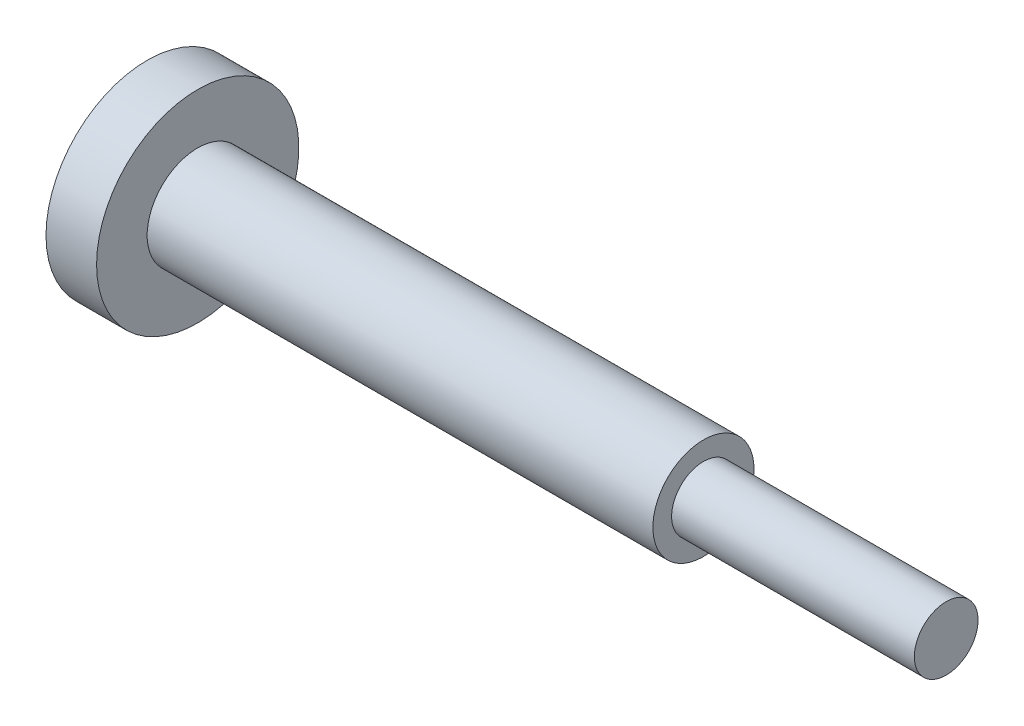
ISO-10303-21;
HEADER;
FILE_DESCRIPTION(('STEP AP214'),'2;1');
FILE_NAME('part.step','',(''),(''),'','','');
FILE_SCHEMA(('AUTOMOTIVE_DESIGN { 1 0 10303 214 1 1 1 1 }'));
ENDSEC;
DATA;
#1=APPLICATION_CONTEXT('core data for automotive mechanical design processes');
#2=APPLICATION_PROTOCOL_DEFINITION('international standard','automotive_design',2000,#1);
#3=PRODUCT_CONTEXT('',#1,'mechanical');
#4=PRODUCT('Part','Part','',(#3));
#5=PRODUCT_RELATED_PRODUCT_CATEGORY('part','',(#4));
#6=PRODUCT_DEFINITION_FORMATION('','',#4);
#7=PRODUCT_DEFINITION_CONTEXT('part definition',#1,'design');
#8=PRODUCT_DEFINITION('design','',#6,#7);
#9=PRODUCT_DEFINITION_SHAPE('','',#8);
#10=(LENGTH_UNIT() NAMED_UNIT(*) SI_UNIT(.MILLI.,.METRE.));
#11=(NAMED_UNIT(*) PLANE_ANGLE_UNIT() SI_UNIT($,.RADIAN.));
#12=(NAMED_UNIT(*) SI_UNIT($,.STERADIAN.) SOLID_ANGLE_UNIT());
#13=UNCERTAINTY_MEASURE_WITH_UNIT(LENGTH_MEASURE(1.E-05),#10,'distance_accuracy_value','');
#14=(GEOMETRIC_REPRESENTATION_CONTEXT(3) GLOBAL_UNCERTAINTY_ASSIGNED_CONTEXT((#13)) GLOBAL_UNIT_ASSIGNED_CONTEXT((#10,
#11,#12)) REPRESENTATION_CONTEXT('',''));
#15=CARTESIAN_POINT('',(0.,0.,0.));
#16=DIRECTION('',(0.,0.,1.));
#17=DIRECTION('',(1.,0.,0.));
#18=AXIS2_PLACEMENT_3D('',#15,#16,#17);
#19=CARTESIAN_POINT('',(15.24,0.,0.));
#20=DIRECTION('',(-1.,0.,0.));
#21=DIRECTION('',(0.,0.,1.));
#22=AXIS2_PLACEMENT_3D('',#19,#20,#21);
#23=CYLINDRICAL_SURFACE('',#22,2.);
#24=CARTESIAN_POINT('',(15.24,0.,0.));
#25=DIRECTION('',(1.,0.,0.));
#26=DIRECTION('',(0.,0.,-1.));
#27=AXIS2_PLACEMENT_3D('',#24,#25,#26);
#28=CIRCLE('',#27,2.);
#29=CARTESIAN_POINT('',(15.24,0.,2.));
#30=VERTEX_POINT('',#29);
#31=EDGE_CURVE('E10',#30,#30,#28,.T.);
#32=CARTESIAN_POINT('',(0.,0.,0.));
#33=DIRECTION('',(1.,0.,0.));
#34=DIRECTION('',(0.,0.,-1.));
#35=AXIS2_PLACEMENT_3D('',#32,#33,#34);
#36=CIRCLE('',#35,2.);
#37=CARTESIAN_POINT('',(0.,0.,2.));
#38=VERTEX_POINT('',#37);
#39=EDGE_CURVE('E38',#38,#38,#36,.T.);
#40=CARTESIAN_POINT('',(15.24,0.,2.));
#41=CARTESIAN_POINT('',(15.08125,0.,2.));
#42=CARTESIAN_POINT('',(14.9225,0.,2.));
#43=CARTESIAN_POINT('',(14.605,0.,2.));
#44=CARTESIAN_POINT('',(14.44625,0.,2.));
#45=CARTESIAN_POINT('',(14.12875,0.,2.));
#46=CARTESIAN_POINT('',(13.97,0.,2.));
#47=CARTESIAN_POINT('',(13.6525,0.,2.));
#48=CARTESIAN_POINT('',(13.49375,0.,2.));
#49=CARTESIAN_POINT('',(13.17625,0.,2.));
#50=CARTESIAN_POINT('',(13.0175,0.,2.));
#51=CARTESIAN_POINT('',(12.7,0.,2.));
#52=CARTESIAN_POINT('',(12.54125,0.,2.));
#53=CARTESIAN_POINT('',(12.22375,0.,2.));
#54=CARTESIAN_POINT('',(12.065,0.,2.));
#55=CARTESIAN_POINT('',(11.7475,0.,2.));
#56=CARTESIAN_POINT('',(11.58875,0.,2.));
#57=CARTESIAN_POINT('',(11.27125,0.,2.));
#58=CARTESIAN_POINT('',(11.1125,0.,2.));
#59=CARTESIAN_POINT('',(10.795,0.,2.));
#60=CARTESIAN_POINT('',(10.63625,0.,2.));
#61=CARTESIAN_POINT('',(10.31875,0.,2.));
#62=CARTESIAN_POINT('',(10.16,0.,2.));
#63=CARTESIAN_POINT('',(9.8425,0.,2.));
#64=CARTESIAN_POINT('',(9.68375,0.,2.));
#65=CARTESIAN_POINT('',(9.36625,0.,2.));
#66=CARTESIAN_POINT('',(9.2075,0.,2.));
#67=CARTESIAN_POINT('',(8.89,0.,2.));
#68=CARTESIAN_POINT('',(8.73125,0.,2.));
#69=CARTESIAN_POINT('',(8.41375,0.,2.));
#70=CARTESIAN_POINT('',(8.255,0.,2.));
#71=CARTESIAN_POINT('',(7.9375,0.,2.));
#72=CARTESIAN_POINT('',(7.77875,0.,2.));
#73=CARTESIAN_POINT('',(7.46125,0.,2.));
#74=CARTESIAN_POINT('',(7.3025,0.,2.));
#75=CARTESIAN_POINT('',(6.985,0.,2.));
#76=CARTESIAN_POINT('',(6.82625,0.,2.));
#77=CARTESIAN_POINT('',(6.50875,0.,2.));
#78=CARTESIAN_POINT('',(6.35,0.,2.));
#79=CARTESIAN_POINT('',(6.0325,0.,2.));
#80=CARTESIAN_POINT('',(5.87375,0.,2.));
#81=CARTESIAN_POINT('',(5.55625,0.,2.));
#82=CARTESIAN_POINT('',(5.3975,0.,2.));
#83=CARTESIAN_POINT('',(5.08,0.,2.));
#84=CARTESIAN_POINT('',(4.92125,0.,2.));
#85=CARTESIAN_POINT('',(4.60375,0.,2.));
#86=CARTESIAN_POINT('',(4.445,0.,2.));
#87=CARTESIAN_POINT('',(4.1275,0.,2.));
#88=CARTESIAN_POINT('',(3.96875,0.,2.));
#89=CARTESIAN_POINT('',(3.65125,0.,2.));
#90=CARTESIAN_POINT('',(3.4925,0.,2.));
#91=CARTESIAN_POINT('',(3.175,0.,2.));
#92=CARTESIAN_POINT('',(3.01625,0.,2.));
#93=CARTESIAN_POINT('',(2.69875,0.,2.));
#94=CARTESIAN_POINT('',(2.54,0.,2.));
#95=CARTESIAN_POINT('',(2.2225,0.,2.));
#96=CARTESIAN_POINT('',(2.06375,0.,2.));
#97=CARTESIAN_POINT('',(1.74625,0.,2.));
#98=CARTESIAN_POINT('',(1.5875,0.,2.));
#99=CARTESIAN_POINT('',(1.27,0.,2.));
#100=CARTESIAN_POINT('',(1.11125,0.,2.));
#101=CARTESIAN_POINT('',(0.79375,0.,2.));
#102=CARTESIAN_POINT('',(0.634999999999999,0.,2.));
#103=CARTESIAN_POINT('',(0.3175,0.,2.));
#104=CARTESIAN_POINT('',(0.15875,0.,2.));
#105=CARTESIAN_POINT('',(0.,0.,2.));
#106=B_SPLINE_CURVE_WITH_KNOTS('',3,(#40,#41,#42,#43,#44,#45,#46,#47,#48,#49,#50,#51,#52,#53,
#54,#55,#56,#57,#58,#59,#60,#61,#62,#63,#64,#65,#66,#67,#68,#69,#70,#71,#72,#73,#74,#75,#76,#77,
#78,#79,#80,#81,#82,#83,#84,#85,#86,#87,#88,#89,#90,#91,#92,#93,#94,#95,#96,#97,#98,#99,#100,
#101,#102,#103,#104,#105),.UNSPECIFIED.,.F.,.F.,(4,2,2,2,2,2,2,2,2,2,2,2,2,2,2,2,2,2,2,2,2,2,2,
2,2,2,2,2,2,2,2,2,4),(0.,0.476249999999999,0.952499999999998,1.42875,1.905,2.38125,2.8575,
3.33375,3.81,4.28625,4.7625,5.23875,5.715,6.19125,6.6675,7.14375,7.62,8.09625,8.5725,9.04875,
9.525,10.00125,10.4775,10.95375,11.43,11.90625,12.3825,12.85875,13.335,13.81125,14.2875,
14.76375,15.24),.UNSPECIFIED.);
#107=EDGE_CURVE('BSEAM35',#30,#38,#106,.T.);
#108=ORIENTED_EDGE('',*,*,#31,.F.);
#109=ORIENTED_EDGE('',*,*,#39,.T.);
#110=ORIENTED_EDGE('',*,*,#107,.T.);
#111=ORIENTED_EDGE('',*,*,#107,.F.);
#112=EDGE_LOOP('',(#108,#110,#109,#111));
#113=FACE_BOUND('',#112,.T.);
#114=ADVANCED_FACE('F35',(#113),#23,.T.);
#115=CARTESIAN_POINT('',(15.24,0.,0.));
#116=DIRECTION('',(1.,0.,0.));
#117=DIRECTION('',(0.,0.,-1.));
#118=AXIS2_PLACEMENT_3D('',#115,#116,#117);
#119=PLANE('',#118);
#120=ORIENTED_EDGE('',*,*,#31,.T.);
#121=EDGE_LOOP('',(#120));
#122=FACE_BOUND('',#121,.T.);
#123=ADVANCED_FACE('F78',(#122),#119,.T.);
#124=CARTESIAN_POINT('',(-31.75,0.,0.));
#125=DIRECTION('',(1.,0.,0.));
#126=DIRECTION('',(0.,0.,-1.));
#127=AXIS2_PLACEMENT_3D('',#124,#125,#126);
#128=CYLINDRICAL_SURFACE('',#127,3.175);
#129=CARTESIAN_POINT('',(-31.75,0.,0.));
#130=DIRECTION('',(1.,0.,0.));
#131=DIRECTION('',(0.,0.,-1.));
#132=AXIS2_PLACEMENT_3D('',#129,#130,#131);
#133=CIRCLE('',#132,3.175);
#134=CARTESIAN_POINT('',(-31.75,0.,-3.175));
#135=VERTEX_POINT('',#134);
#136=EDGE_CURVE('E49',#135,#135,#133,.T.);
#137=ORIENTED_EDGE('',*,*,#136,.T.);
#138=EDGE_LOOP('',(#137));
#139=FACE_BOUND('',#138,.T.);
#140=CARTESIAN_POINT('',(0.,0.,0.));
#141=DIRECTION('',(1.,0.,0.));
#142=DIRECTION('',(0.,0.,-1.));
#143=AXIS2_PLACEMENT_3D('',#140,#141,#142);
#144=CIRCLE('',#143,3.175);
#145=CARTESIAN_POINT('',(0.,0.,-3.175));
#146=VERTEX_POINT('',#145);
#147=EDGE_CURVE('E45',#146,#146,#144,.T.);
#148=ORIENTED_EDGE('',*,*,#147,.F.);
#149=EDGE_LOOP('',(#148));
#150=FACE_BOUND('',#149,.T.);
#151=ADVANCED_FACE('F83',(#139,#150),#128,.T.);
#152=CARTESIAN_POINT('',(0.,0.,0.));
#153=DIRECTION('',(1.,0.,0.));
#154=DIRECTION('',(0.,0.,-1.));
#155=AXIS2_PLACEMENT_3D('',#152,#153,#154);
#156=PLANE('',#155);
#157=ORIENTED_EDGE('',*,*,#39,.F.);
#158=EDGE_LOOP('',(#157));
#159=FACE_BOUND('',#158,.T.);
#160=ORIENTED_EDGE('',*,*,#147,.T.);
#161=EDGE_LOOP('',(#160));
#162=FACE_BOUND('',#161,.T.);
#163=ADVANCED_FACE('F64',(#159,#162),#156,.T.);
#164=CARTESIAN_POINT('',(-34.925,0.,0.));
#165=DIRECTION('',(1.,0.,0.));
#166=DIRECTION('',(0.,0.,-1.));
#167=AXIS2_PLACEMENT_3D('',#164,#165,#166);
#168=CYLINDRICAL_SURFACE('',#167,6.35);
#169=CARTESIAN_POINT('',(-34.925,0.,0.));
#170=DIRECTION('',(-1.,0.,0.));
#171=DIRECTION('',(0.,0.,1.));
#172=AXIS2_PLACEMENT_3D('',#169,#170,#171);
#173=CIRCLE('',#172,6.35);
#174=CARTESIAN_POINT('',(-34.925,0.,6.35));
#175=VERTEX_POINT('',#174);
#176=EDGE_CURVE('E52',#175,#175,#173,.T.);
#177=ORIENTED_EDGE('',*,*,#176,.F.);
#178=EDGE_LOOP('',(#177));
#179=FACE_BOUND('',#178,.T.);
#180=CARTESIAN_POINT('',(-31.75,0.,0.));
#181=DIRECTION('',(-1.,0.,0.));
#182=DIRECTION('',(0.,0.,1.));
#183=AXIS2_PLACEMENT_3D('',#180,#181,#182);
#184=CIRCLE('',#183,6.35);
#185=CARTESIAN_POINT('',(-31.75,0.,6.35));
#186=VERTEX_POINT('',#185);
#187=EDGE_CURVE('E53',#186,#186,#184,.T.);
#188=ORIENTED_EDGE('',*,*,#187,.T.);
#189=EDGE_LOOP('',(#188));
#190=FACE_BOUND('',#189,.T.);
#191=ADVANCED_FACE('F61',(#179,#190),#168,.T.);
#192=CARTESIAN_POINT('',(-34.925,0.,0.));
#193=DIRECTION('',(-1.,0.,0.));
#194=DIRECTION('',(0.,0.,1.));
#195=AXIS2_PLACEMENT_3D('',#192,#193,#194);
#196=PLANE('',#195);
#197=ORIENTED_EDGE('',*,*,#176,.T.);
#198=EDGE_LOOP('',(#197));
#199=FACE_BOUND('',#198,.T.);
#200=ADVANCED_FACE('F59',(#199),#196,.T.);
#201=CARTESIAN_POINT('',(-31.75,0.,0.));
#202=DIRECTION('',(-1.,0.,0.));
#203=DIRECTION('',(0.,0.,1.));
#204=AXIS2_PLACEMENT_3D('',#201,#202,#203);
#205=PLANE('',#204);
#206=ORIENTED_EDGE('',*,*,#136,.F.);
#207=EDGE_LOOP('',(#206));
#208=FACE_BOUND('',#207,.T.);
#209=ORIENTED_EDGE('',*,*,#187,.F.);
#210=EDGE_LOOP('',(#209));
#211=FACE_BOUND('',#210,.T.);
#212=ADVANCED_FACE('F68',(#208,#211),#205,.F.);
#213=CLOSED_SHELL('',(#114,#123,#151,#163,#191,#200,#212));
#214=MANIFOLD_SOLID_BREP('B2',#213);
#215=ADVANCED_BREP_SHAPE_REPRESENTATION('',(#18,#214),#14);
#216=SHAPE_DEFINITION_REPRESENTATION(#9,#215);
ENDSEC;
END-ISO-10303-21;
